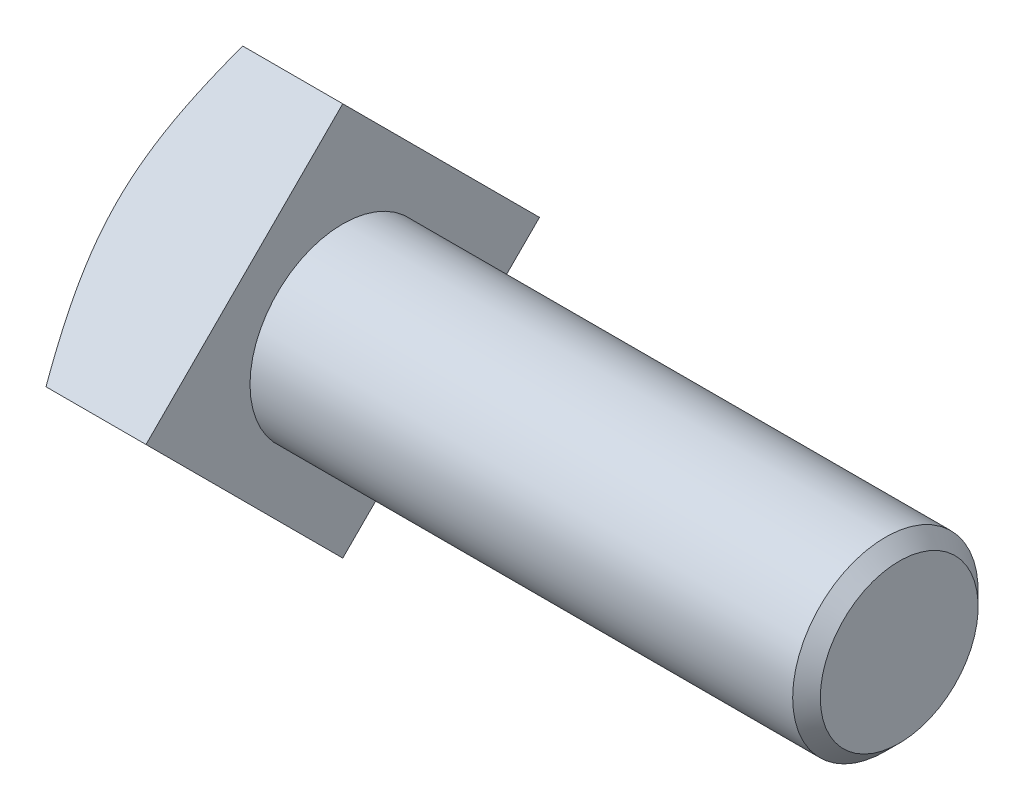
ISO-10303-21;
HEADER;
FILE_DESCRIPTION(('STEP AP214'),'2;1');
FILE_NAME('part.step','',(''),(''),'','','');
FILE_SCHEMA(('AUTOMOTIVE_DESIGN { 1 0 10303 214 1 1 1 1 }'));
ENDSEC;
DATA;
#1=APPLICATION_CONTEXT('core data for automotive mechanical design processes');
#2=APPLICATION_PROTOCOL_DEFINITION('international standard','automotive_design',2000,#1);
#3=PRODUCT_CONTEXT('',#1,'mechanical');
#4=PRODUCT('Part','Part','',(#3));
#5=PRODUCT_RELATED_PRODUCT_CATEGORY('part','',(#4));
#6=PRODUCT_DEFINITION_FORMATION('','',#4);
#7=PRODUCT_DEFINITION_CONTEXT('part definition',#1,'design');
#8=PRODUCT_DEFINITION('design','',#6,#7);
#9=PRODUCT_DEFINITION_SHAPE('','',#8);
#10=(LENGTH_UNIT() NAMED_UNIT(*) SI_UNIT(.MILLI.,.METRE.));
#11=(NAMED_UNIT(*) PLANE_ANGLE_UNIT() SI_UNIT($,.RADIAN.));
#12=(NAMED_UNIT(*) SI_UNIT($,.STERADIAN.) SOLID_ANGLE_UNIT());
#13=UNCERTAINTY_MEASURE_WITH_UNIT(LENGTH_MEASURE(1.E-05),#10,'distance_accuracy_value','');
#14=(GEOMETRIC_REPRESENTATION_CONTEXT(3) GLOBAL_UNCERTAINTY_ASSIGNED_CONTEXT((#13)) GLOBAL_UNIT_ASSIGNED_CONTEXT((#10,
#11,#12)) REPRESENTATION_CONTEXT('',''));
#15=CARTESIAN_POINT('',(0.,0.,0.));
#16=DIRECTION('',(0.,0.,1.));
#17=DIRECTION('',(1.,0.,0.));
#18=AXIS2_PLACEMENT_3D('',#15,#16,#17);
#19=CARTESIAN_POINT('',(17.3736,0.,-26.9407683632075));
#20=DIRECTION('',(0.,-0.707106781186549,0.707106781186546));
#21=DIRECTION('',(0.,-0.707106781186546,-0.707106781186549));
#22=AXIS2_PLACEMENT_3D('',#19,#20,#21);
#23=PLANE('',#22);
#24=CARTESIAN_POINT('',(3.67961897836863,26.9409683632075,0.000200000000045216));
#25=CARTESIAN_POINT('',(3.5548106744779,26.6733023350022,-0.267466028205203));
#26=CARTESIAN_POINT('',(3.43166591489863,26.4052457385589,-0.535522624648477));
#27=CARTESIAN_POINT('',(3.1890899267751,25.8682845755296,-1.0724837876778));
#28=CARTESIAN_POINT('',(3.06965881940346,25.5993799815889,-1.34138838161848));
#29=CARTESIAN_POINT('',(2.83485734138483,25.0605646045843,-1.88020375862312));
#30=CARTESIAN_POINT('',(2.71948863089288,24.7906534588859,-2.15011490432156));
#31=CARTESIAN_POINT('',(2.49331484279292,24.2498808259797,-2.69088753722775));
#32=CARTESIAN_POINT('',(2.38250972891658,23.9790193463431,-2.96174901686432));
#33=CARTESIAN_POINT('',(2.05612530796253,23.1610744333138,-3.77969392989365));
#34=CARTESIAN_POINT('',(1.84824930439006,22.6124346923039,-4.32833367090352));
#35=CARTESIAN_POINT('',(1.45758123264963,21.5107337556084,-5.430034607599));
#36=CARTESIAN_POINT('',(1.27478662714833,20.9576730131681,-5.9830953500393));
#37=CARTESIAN_POINT('',(0.945511734071481,19.8664326312515,-7.07433573195595));
#38=CARTESIAN_POINT('',(0.79798088957727,19.3284131944761,-7.61235516873135));
#39=CARTESIAN_POINT('',(0.536422228800219,18.2482773891681,-8.69249097403933));
#40=CARTESIAN_POINT('',(0.422394171895823,17.7061610500887,-9.23460731311871));
#41=CARTESIAN_POINT('',(0.233146716482555,16.6203771657464,-10.3203911974611));
#42=CARTESIAN_POINT('',(0.157794101744971,16.0767215200036,-10.8640468432038));
#43=CARTESIAN_POINT('',(0.0762638360765365,15.2597076194693,-11.6810607437382));
#44=CARTESIAN_POINT('',(0.0543365936512322,14.9871029257431,-11.9536654374643));
#45=CARTESIAN_POINT('',(0.0212582185382671,14.4415698757762,-12.4991984874312));
#46=CARTESIAN_POINT('',(0.0101066830280692,14.1686415320162,-12.7721268311912));
#47=CARTESIAN_POINT('',(-0.00161011344190508,13.605599139522,-13.3351692236855));
#48=CARTESIAN_POINT('',(-0.00146976557287539,13.3154776845977,-13.6252906786097));
#49=CARTESIAN_POINT('',(0.011159967421425,12.7353688974673,-14.2053994657402));
#50=CARTESIAN_POINT('',(0.0236494175099609,12.4453815659747,-14.4953867972328));
#51=CARTESIAN_POINT('',(0.0607802459783497,11.8657903885889,-15.0749779746185));
#52=CARTESIAN_POINT('',(0.0854218766143621,11.5761865507815,-15.364581812426));
#53=CARTESIAN_POINT('',(0.146470352139668,10.9975953278747,-15.9431730353328));
#54=CARTESIAN_POINT('',(0.182877743644435,10.7086079720439,-16.2321603911635));
#55=CARTESIAN_POINT('',(0.309293308607137,9.84074831588848,-17.100020047319));
#56=CARTESIAN_POINT('',(0.416353313854458,9.26308735289191,-17.6776810103156));
#57=CARTESIAN_POINT('',(0.670258795524519,8.11225138699092,-18.8285169762166));
#58=CARTESIAN_POINT('',(0.81710493512163,7.53907645902574,-19.4016919041817));
#59=CARTESIAN_POINT('',(1.15063001194142,6.37560138249195,-20.5651669807155));
#60=CARTESIAN_POINT('',(1.33862518399708,5.78549181858159,-21.1552765446259));
#61=CARTESIAN_POINT('',(1.74416737172929,4.61034109547358,-22.3304272677339));
#62=CARTESIAN_POINT('',(1.96171822054831,4.0253006041821,-22.9154677590254));
#63=CARTESIAN_POINT('',(2.30502412485186,3.15351567590044,-23.7872526873071));
#64=CARTESIAN_POINT('',(2.42180887555157,2.86498021977967,-24.0757881434278));
#65=CARTESIAN_POINT('',(2.66065189048929,2.28899759935433,-24.6517707638532));
#66=CARTESIAN_POINT('',(2.78271020630349,2.00155044572342,-24.9392179174841));
#67=CARTESIAN_POINT('',(3.03148171467405,1.42782962681058,-25.5129387363969));
#68=CARTESIAN_POINT('',(3.15819248210805,1.14155543424872,-25.7992129289588));
#69=CARTESIAN_POINT('',(3.41584794221307,0.569973412950501,-26.370794950257));
#70=CARTESIAN_POINT('',(3.54679246370201,0.284665545657028,-26.6561028175505));
#71=CARTESIAN_POINT('',(3.67961897836863,-0.000199999999958303,-26.9409683632075));
#72=B_SPLINE_CURVE_WITH_KNOTS('',3,(#24,#25,#26,#27,#28,#29,#30,#31,#32,#33,#34,#35,#36,#37,#38,
#39,#40,#41,#42,#43,#44,#45,#46,#47,#48,#49,#50,#51,#52,#53,#54,#55,#56,#57,#58,#59,#60,#61,#62,
#63,#64,#65,#66,#67,#68,#69,#70,#71),.UNSPECIFIED.,.F.,.F.,(4,2,2,2,2,2,2,2,2,2,2,2,2,2,2,2,2,2,
2,2,2,2,2,4),(0.,1.19574621782804,2.39153141076051,3.5877997366759,4.78405855363789,
7.1934730092088,9.60264353889679,11.9271362943406,14.2516123545547,16.5680271795087,
17.726333362957,18.8845962443842,20.1152898057051,21.3459898412049,22.5767154247725,
23.8074981937946,26.2780083205153,28.7485596294176,31.3142561631337,33.8802857660488,
35.1535601561366,36.4268470018451,37.6994793066262,38.9720602196475),.UNSPECIFIED.);
#73=CARTESIAN_POINT('',(3.67952571649083,26.9407683632075,0.));
#74=VERTEX_POINT('',#73);
#75=CARTESIAN_POINT('',(0.,13.4703841816038,-13.4703841816037));
#76=VERTEX_POINT('',#75);
#77=EDGE_CURVE('E101',#74,#76,#72,.T.);
#78=ORIENTED_EDGE('',*,*,#77,.F.);
#79=DIRECTION('',(-1.,0.,0.));
#80=VECTOR('',#79,1.);
#81=CARTESIAN_POINT('',(17.3736,26.9407683632075,0.));
#82=LINE('',#81,#80);
#83=CARTESIAN_POINT('',(17.3736,26.9407683632075,0.));
#84=VERTEX_POINT('',#83);
#85=EDGE_CURVE('E111',#84,#74,#82,.T.);
#86=ORIENTED_EDGE('',*,*,#85,.F.);
#87=DIRECTION('',(0.,0.707106781186546,0.707106781186549));
#88=VECTOR('',#87,1.);
#89=CARTESIAN_POINT('',(17.3736,0.,-26.9407683632075));
#90=LINE('',#89,#88);
#91=CARTESIAN_POINT('',(17.3736,0.,-26.9407683632075));
#92=VERTEX_POINT('',#91);
#93=EDGE_CURVE('E182',#92,#84,#90,.T.);
#94=ORIENTED_EDGE('',*,*,#93,.F.);
#95=DIRECTION('',(-1.,0.,0.));
#96=VECTOR('',#95,1.);
#97=CARTESIAN_POINT('',(17.3736,0.,-26.9407683632075));
#98=LINE('',#97,#96);
#99=CARTESIAN_POINT('',(3.67952571649083,0.,-26.9407683632075));
#100=VERTEX_POINT('',#99);
#101=EDGE_CURVE('E181',#92,#100,#98,.T.);
#102=ORIENTED_EDGE('',*,*,#101,.T.);
#103=EDGE_CURVE('E53',#76,#100,#72,.T.);
#104=ORIENTED_EDGE('',*,*,#103,.F.);
#105=EDGE_LOOP('',(#78,#86,#94,#102,#104));
#106=FACE_BOUND('',#105,.T.);
#107=ADVANCED_FACE('F32',(#106),#23,.F.);
#108=CARTESIAN_POINT('',(17.3736,0.,26.9407683632075));
#109=DIRECTION('',(0.,0.707106781186546,0.707106781186549));
#110=DIRECTION('',(0.,-0.707106781186549,0.707106781186546));
#111=AXIS2_PLACEMENT_3D('',#108,#109,#110);
#112=PLANE('',#111);
#113=ORIENTED_EDGE('',*,*,#85,.T.);
#114=CARTESIAN_POINT('',(3.67961897836863,26.9409683632075,-0.000199999999958046));
#115=CARTESIAN_POINT('',(3.5548106744779,26.6733023350022,0.267466028205296));
#116=CARTESIAN_POINT('',(3.43166591489863,26.4052457385589,0.535522624648567));
#117=CARTESIAN_POINT('',(3.1890899267751,25.8682845755296,1.07248378767788));
#118=CARTESIAN_POINT('',(3.06965881940345,25.5993799815889,1.34138838161855));
#119=CARTESIAN_POINT('',(2.83485734138483,25.0605646045843,1.8802037586232));
#120=CARTESIAN_POINT('',(2.71948863089288,24.7906534588859,2.15011490432164));
#121=CARTESIAN_POINT('',(2.49331484279293,24.2498808259797,2.69088753722783));
#122=CARTESIAN_POINT('',(2.38250972891658,23.9790193463431,2.9617490168644));
#123=CARTESIAN_POINT('',(2.05612530796252,23.1610744333138,3.77969392989372));
#124=CARTESIAN_POINT('',(1.84824930439005,22.6124346923039,4.3283336709036));
#125=CARTESIAN_POINT('',(1.45758123264963,21.5107337556084,5.43003460759907));
#126=CARTESIAN_POINT('',(1.27478662714833,20.9576730131681,5.98309535003937));
#127=CARTESIAN_POINT('',(0.945511734071483,19.8664326312515,7.07433573195601));
#128=CARTESIAN_POINT('',(0.797980889577271,19.3284131944761,7.61235516873141));
#129=CARTESIAN_POINT('',(0.536422228800219,18.2482773891681,8.69249097403939));
#130=CARTESIAN_POINT('',(0.422394171895823,17.7061610500887,9.23460731311877));
#131=CARTESIAN_POINT('',(0.233146716482557,16.6203771657463,10.3203911974611));
#132=CARTESIAN_POINT('',(0.157794101744973,16.0767215200036,10.8640468432039));
#133=CARTESIAN_POINT('',(0.0762638360765367,15.2597076194692,11.6810607437382));
#134=CARTESIAN_POINT('',(0.0543365936512313,14.9871029257431,11.9536654374644));
#135=CARTESIAN_POINT('',(0.0212582185382664,14.4415698757762,12.4991984874313));
#136=CARTESIAN_POINT('',(0.0101066830280697,14.1686415320162,12.7721268311913));
#137=CARTESIAN_POINT('',(-0.00161011344190393,13.6055991395219,13.3351692236856));
#138=CARTESIAN_POINT('',(-0.00146976557287488,13.3154776845977,13.6252906786098));
#139=CARTESIAN_POINT('',(0.0111599674214245,12.7353688974672,14.2053994657402));
#140=CARTESIAN_POINT('',(0.02364941750996,12.4453815659746,14.4953867972328));
#141=CARTESIAN_POINT('',(0.0607802459783491,11.8657903885889,15.0749779746186));
#142=CARTESIAN_POINT('',(0.0854218766143621,11.5761865507815,15.364581812426));
#143=CARTESIAN_POINT('',(0.146470352139668,10.9975953278746,15.9431730353328));
#144=CARTESIAN_POINT('',(0.182877743644435,10.7086079720439,16.2321603911636));
#145=CARTESIAN_POINT('',(0.309293308607135,9.84074831588842,17.100020047319));
#146=CARTESIAN_POINT('',(0.416353313854456,9.26308735289185,17.6776810103156));
#147=CARTESIAN_POINT('',(0.670258795524518,8.11225138699086,18.8285169762166));
#148=CARTESIAN_POINT('',(0.81710493512163,7.53907645902568,19.4016919041818));
#149=CARTESIAN_POINT('',(1.15063001194141,6.37560138249188,20.5651669807155));
#150=CARTESIAN_POINT('',(1.33862518399708,5.78549181858152,21.1552765446259));
#151=CARTESIAN_POINT('',(1.74416737172928,4.61034109547351,22.3304272677339));
#152=CARTESIAN_POINT('',(1.96171822054831,4.02530060418203,22.9154677590254));
#153=CARTESIAN_POINT('',(2.30502412485186,3.15351567590037,23.7872526873071));
#154=CARTESIAN_POINT('',(2.42180887555157,2.86498021977959,24.0757881434278));
#155=CARTESIAN_POINT('',(2.66065189048929,2.28899759935425,24.6517707638532));
#156=CARTESIAN_POINT('',(2.78271020630349,2.00155044572334,24.9392179174841));
#157=CARTESIAN_POINT('',(3.03148171467405,1.42782962681049,25.5129387363969));
#158=CARTESIAN_POINT('',(3.15819248210805,1.14155543424863,25.7992129289588));
#159=CARTESIAN_POINT('',(3.41584794221307,0.569973412950413,26.370794950257));
#160=CARTESIAN_POINT('',(3.54679246370201,0.284665545656939,26.6561028175505));
#161=CARTESIAN_POINT('',(3.67961897836863,-0.0002000000000479,26.9409683632075));
#162=B_SPLINE_CURVE_WITH_KNOTS('',3,(#114,#115,#116,#117,#118,#119,#120,#121,#122,#123,#124,
#125,#126,#127,#128,#129,#130,#131,#132,#133,#134,#135,#136,#137,#138,#139,#140,#141,#142,#143,
#144,#145,#146,#147,#148,#149,#150,#151,#152,#153,#154,#155,#156,#157,#158,#159,#160,#161),
.UNSPECIFIED.,.F.,.F.,(4,2,2,2,2,2,2,2,2,2,2,2,2,2,2,2,2,2,2,2,2,2,2,4),(0.,1.19574621782803,
2.39153141076051,3.5877997366759,4.78405855363789,7.1934730092088,9.60264353889679,
11.9271362943406,14.2516123545547,16.5680271795087,17.726333362957,18.8845962443842,
20.1152898057051,21.3459898412049,22.5767154247725,23.8074981937946,26.2780083205153,
28.7485596294176,31.3142561631337,33.8802857660488,35.1535601561366,36.4268470018451,
37.6994793066262,38.9720602196475),.UNSPECIFIED.);
#163=CARTESIAN_POINT('',(0.,13.4703841816037,13.4703841816038));
#164=VERTEX_POINT('',#163);
#165=EDGE_CURVE('E94',#74,#164,#162,.T.);
#166=ORIENTED_EDGE('',*,*,#165,.T.);
#167=CARTESIAN_POINT('',(3.67952571649083,0.,26.9407683632075));
#168=VERTEX_POINT('',#167);
#169=EDGE_CURVE('E85',#164,#168,#162,.T.);
#170=ORIENTED_EDGE('',*,*,#169,.T.);
#171=DIRECTION('',(-1.,0.,0.));
#172=VECTOR('',#171,1.);
#173=CARTESIAN_POINT('',(17.3736,0.,26.9407683632075));
#174=LINE('',#173,#172);
#175=CARTESIAN_POINT('',(17.3736,0.,26.9407683632075));
#176=VERTEX_POINT('',#175);
#177=EDGE_CURVE('E189',#176,#168,#174,.T.);
#178=ORIENTED_EDGE('',*,*,#177,.F.);
#179=DIRECTION('',(0.,0.707106781186549,-0.707106781186546));
#180=VECTOR('',#179,1.);
#181=CARTESIAN_POINT('',(17.3736,0.,26.9407683632075));
#182=LINE('',#181,#180);
#183=EDGE_CURVE('E205',#176,#84,#182,.T.);
#184=ORIENTED_EDGE('',*,*,#183,.T.);
#185=EDGE_LOOP('',(#113,#166,#170,#178,#184));
#186=FACE_BOUND('',#185,.T.);
#187=ADVANCED_FACE('F108',(#186),#112,.T.);
#188=CARTESIAN_POINT('',(17.3736,0.,26.9407683632075));
#189=DIRECTION('',(0.,0.707106781186549,-0.707106781186546));
#190=DIRECTION('',(0.,0.707106781186546,0.707106781186549));
#191=AXIS2_PLACEMENT_3D('',#188,#189,#190);
#192=PLANE('',#191);
#193=CARTESIAN_POINT('',(3.67961897836863,-26.9409683632075,-0.000200000000037707));
#194=CARTESIAN_POINT('',(3.5548106744779,-26.6733023350022,0.267466028205212));
#195=CARTESIAN_POINT('',(3.43166591489863,-26.4052457385589,0.535522624648485));
#196=CARTESIAN_POINT('',(3.1890899267751,-25.8682845755296,1.07248378767781));
#197=CARTESIAN_POINT('',(3.06965881940346,-25.5993799815889,1.34138838161848));
#198=CARTESIAN_POINT('',(2.83485734138483,-25.0605646045843,1.88020375862312));
#199=CARTESIAN_POINT('',(2.71948863089288,-24.7906534588859,2.15011490432156));
#200=CARTESIAN_POINT('',(2.49331484279292,-24.2498808259797,2.69088753722775));
#201=CARTESIAN_POINT('',(2.38250972891658,-23.9790193463431,2.96174901686433));
#202=CARTESIAN_POINT('',(2.05612530796253,-23.1610744333138,3.77969392989365));
#203=CARTESIAN_POINT('',(1.84824930439006,-22.6124346923039,4.32833367090353));
#204=CARTESIAN_POINT('',(1.45758123264964,-21.5107337556084,5.430034607599));
#205=CARTESIAN_POINT('',(1.27478662714834,-20.9576730131681,5.98309535003931));
#206=CARTESIAN_POINT('',(0.945511734071484,-19.8664326312515,7.07433573195595));
#207=CARTESIAN_POINT('',(0.797980889577274,-19.3284131944761,7.61235516873135));
#208=CARTESIAN_POINT('',(0.536422228800222,-18.2482773891681,8.69249097403933));
#209=CARTESIAN_POINT('',(0.422394171895826,-17.7061610500887,9.23460731311871));
#210=CARTESIAN_POINT('',(0.233146716482558,-16.6203771657464,10.3203911974611));
#211=CARTESIAN_POINT('',(0.157794101744974,-16.0767215200036,10.8640468432038));
#212=CARTESIAN_POINT('',(0.0762638360765389,-15.2597076194693,11.6810607437382));
#213=CARTESIAN_POINT('',(0.0543365936512346,-14.9871029257431,11.9536654374643));
#214=CARTESIAN_POINT('',(0.0212582185382695,-14.4415698757762,12.4991984874312));
#215=CARTESIAN_POINT('',(0.0101066830280716,-14.1686415320162,12.7721268311912));
#216=CARTESIAN_POINT('',(-0.0016101134419026,-13.605599139522,13.3351692236855));
#217=CARTESIAN_POINT('',(-0.00146976557287277,-13.3154776845977,13.6252906786097));
#218=CARTESIAN_POINT('',(0.0111599674214272,-12.7353688974673,14.2053994657402));
#219=CARTESIAN_POINT('',(0.0236494175099626,-12.4453815659747,14.4953867972328));
#220=CARTESIAN_POINT('',(0.0607802459783512,-11.8657903885889,15.0749779746185));
#221=CARTESIAN_POINT('',(0.0854218766143637,-11.5761865507815,15.364581812426));
#222=CARTESIAN_POINT('',(0.146470352139669,-10.9975953278747,15.9431730353328));
#223=CARTESIAN_POINT('',(0.182877743644437,-10.7086079720439,16.2321603911635));
#224=CARTESIAN_POINT('',(0.309293308607138,-9.84074831588848,17.100020047319));
#225=CARTESIAN_POINT('',(0.416353313854458,-9.26308735289192,17.6776810103156));
#226=CARTESIAN_POINT('',(0.670258795524519,-8.11225138699093,18.8285169762166));
#227=CARTESIAN_POINT('',(0.817104935121631,-7.53907645902575,19.4016919041817));
#228=CARTESIAN_POINT('',(1.15063001194142,-6.37560138249196,20.5651669807155));
#229=CARTESIAN_POINT('',(1.33862518399708,-5.7854918185816,21.1552765446259));
#230=CARTESIAN_POINT('',(1.74416737172929,-4.61034109547359,22.3304272677339));
#231=CARTESIAN_POINT('',(1.96171822054831,-4.02530060418211,22.9154677590254));
#232=CARTESIAN_POINT('',(2.30502412485186,-3.15351567590045,23.787252687307));
#233=CARTESIAN_POINT('',(2.42180887555157,-2.86498021977968,24.0757881434278));
#234=CARTESIAN_POINT('',(2.66065189048929,-2.28899759935433,24.6517707638532));
#235=CARTESIAN_POINT('',(2.78271020630349,-2.00155044572343,24.9392179174841));
#236=CARTESIAN_POINT('',(3.03148171467405,-1.42782962681058,25.5129387363969));
#237=CARTESIAN_POINT('',(3.15819248210805,-1.14155543424872,25.7992129289588));
#238=CARTESIAN_POINT('',(3.41584794221307,-0.569973412950508,26.370794950257));
#239=CARTESIAN_POINT('',(3.54679246370201,-0.284665545657037,26.6561028175505));
#240=CARTESIAN_POINT('',(3.67961897836863,0.000199999999947534,26.9409683632075));
#241=B_SPLINE_CURVE_WITH_KNOTS('',3,(#193,#194,#195,#196,#197,#198,#199,#200,#201,#202,#203,
#204,#205,#206,#207,#208,#209,#210,#211,#212,#213,#214,#215,#216,#217,#218,#219,#220,#221,#222,
#223,#224,#225,#226,#227,#228,#229,#230,#231,#232,#233,#234,#235,#236,#237,#238,#239,#240),
.UNSPECIFIED.,.F.,.F.,(4,2,2,2,2,2,2,2,2,2,2,2,2,2,2,2,2,2,2,2,2,2,2,4),(0.,1.19574621782803,
2.39153141076051,3.5877997366759,4.78405855363788,7.1934730092088,9.60264353889679,
11.9271362943406,14.2516123545547,16.5680271795087,17.726333362957,18.8845962443842,
20.1152898057051,21.3459898412049,22.5767154247725,23.8074981937946,26.2780083205153,
28.7485596294175,31.3142561631337,33.8802857660488,35.1535601561366,36.4268470018451,
37.6994793066262,38.9720602196474),.UNSPECIFIED.);
#242=CARTESIAN_POINT('',(3.67952571649083,-26.9407683632075,0.));
#243=VERTEX_POINT('',#242);
#244=CARTESIAN_POINT('',(0.,-13.4703841816038,13.4703841816037));
#245=VERTEX_POINT('',#244);
#246=EDGE_CURVE('E142',#243,#245,#241,.T.);
#247=ORIENTED_EDGE('',*,*,#246,.F.);
#248=DIRECTION('',(-1.,0.,0.));
#249=VECTOR('',#248,1.);
#250=CARTESIAN_POINT('',(17.3736,-26.9407683632075,0.));
#251=LINE('',#250,#249);
#252=CARTESIAN_POINT('',(17.3736,-26.9407683632075,0.));
#253=VERTEX_POINT('',#252);
#254=EDGE_CURVE('E185',#253,#243,#251,.T.);
#255=ORIENTED_EDGE('',*,*,#254,.F.);
#256=DIRECTION('',(0.,-0.707106781186546,-0.707106781186549));
#257=VECTOR('',#256,1.);
#258=CARTESIAN_POINT('',(17.3736,0.,26.9407683632075));
#259=LINE('',#258,#257);
#260=EDGE_CURVE('E191',#176,#253,#259,.T.);
#261=ORIENTED_EDGE('',*,*,#260,.F.);
#262=ORIENTED_EDGE('',*,*,#177,.T.);
#263=EDGE_CURVE('E90',#245,#168,#241,.T.);
#264=ORIENTED_EDGE('',*,*,#263,.F.);
#265=EDGE_LOOP('',(#247,#255,#261,#262,#264));
#266=FACE_BOUND('',#265,.T.);
#267=ADVANCED_FACE('F147',(#266),#192,.F.);
#268=CARTESIAN_POINT('',(17.3736,0.,-26.9407683632075));
#269=DIRECTION('',(0.,-0.707106781186546,-0.707106781186549));
#270=DIRECTION('',(0.,0.707106781186549,-0.707106781186546));
#271=AXIS2_PLACEMENT_3D('',#268,#269,#270);
#272=PLANE('',#271);
#273=ORIENTED_EDGE('',*,*,#254,.T.);
#274=CARTESIAN_POINT('',(3.67961897836863,-26.9409683632075,0.000199999999957179));
#275=CARTESIAN_POINT('',(3.5548106744779,-26.6733023350022,-0.267466028205298));
#276=CARTESIAN_POINT('',(3.43166591489863,-26.4052457385589,-0.535522624648569));
#277=CARTESIAN_POINT('',(3.1890899267751,-25.8682845755296,-1.07248378767788));
#278=CARTESIAN_POINT('',(3.06965881940346,-25.5993799815889,-1.34138838161855));
#279=CARTESIAN_POINT('',(2.83485734138483,-25.0605646045843,-1.8802037586232));
#280=CARTESIAN_POINT('',(2.71948863089288,-24.7906534588859,-2.15011490432164));
#281=CARTESIAN_POINT('',(2.49331484279293,-24.2498808259797,-2.69088753722783));
#282=CARTESIAN_POINT('',(2.38250972891658,-23.9790193463431,-2.9617490168644));
#283=CARTESIAN_POINT('',(2.05612530796253,-23.1610744333138,-3.77969392989372));
#284=CARTESIAN_POINT('',(1.84824930439006,-22.6124346923039,-4.32833367090359));
#285=CARTESIAN_POINT('',(1.45758123264964,-21.5107337556084,-5.43003460759906));
#286=CARTESIAN_POINT('',(1.27478662714834,-20.9576730131681,-5.98309535003937));
#287=CARTESIAN_POINT('',(0.945511734071483,-19.8664326312515,-7.07433573195601));
#288=CARTESIAN_POINT('',(0.797980889577275,-19.3284131944761,-7.61235516873141));
#289=CARTESIAN_POINT('',(0.536422228800223,-18.2482773891681,-8.69249097403939));
#290=CARTESIAN_POINT('',(0.422394171895824,-17.7061610500887,-9.23460731311877));
#291=CARTESIAN_POINT('',(0.233146716482556,-16.6203771657463,-10.3203911974611));
#292=CARTESIAN_POINT('',(0.157794101744973,-16.0767215200036,-10.8640468432039));
#293=CARTESIAN_POINT('',(0.076263836076538,-15.2597076194692,-11.6810607437382));
#294=CARTESIAN_POINT('',(0.054336593651233,-14.9871029257431,-11.9536654374644));
#295=CARTESIAN_POINT('',(0.0212582185382679,-14.4415698757762,-12.4991984874313));
#296=CARTESIAN_POINT('',(0.0101066830280708,-14.1686415320162,-12.7721268311913));
#297=CARTESIAN_POINT('',(-0.00161011344190344,-13.6055991395219,-13.3351692236855));
#298=CARTESIAN_POINT('',(-0.00146976557287458,-13.3154776845977,-13.6252906786098));
#299=CARTESIAN_POINT('',(0.0111599674214242,-12.7353688974672,-14.2053994657402));
#300=CARTESIAN_POINT('',(0.0236494175099593,-12.4453815659746,-14.4953867972328));
#301=CARTESIAN_POINT('',(0.0607802459783481,-11.8657903885889,-15.0749779746186));
#302=CARTESIAN_POINT('',(0.0854218766143613,-11.5761865507815,-15.364581812426));
#303=CARTESIAN_POINT('',(0.146470352139667,-10.9975953278747,-15.9431730353328));
#304=CARTESIAN_POINT('',(0.182877743644434,-10.7086079720439,-16.2321603911636));
#305=CARTESIAN_POINT('',(0.309293308607134,-9.84074831588843,-17.100020047319));
#306=CARTESIAN_POINT('',(0.416353313854455,-9.26308735289186,-17.6776810103156));
#307=CARTESIAN_POINT('',(0.670258795524518,-8.11225138699086,-18.8285169762166));
#308=CARTESIAN_POINT('',(0.81710493512163,-7.53907645902569,-19.4016919041818));
#309=CARTESIAN_POINT('',(1.15063001194142,-6.37560138249189,-20.5651669807155));
#310=CARTESIAN_POINT('',(1.33862518399708,-5.78549181858152,-21.1552765446259));
#311=CARTESIAN_POINT('',(1.74416737172929,-4.61034109547351,-22.3304272677339));
#312=CARTESIAN_POINT('',(1.96171822054831,-4.02530060418203,-22.9154677590254));
#313=CARTESIAN_POINT('',(2.30502412485186,-3.15351567590037,-23.7872526873071));
#314=CARTESIAN_POINT('',(2.42180887555157,-2.86498021977959,-24.0757881434278));
#315=CARTESIAN_POINT('',(2.66065189048929,-2.28899759935425,-24.6517707638532));
#316=CARTESIAN_POINT('',(2.78271020630349,-2.00155044572334,-24.9392179174841));
#317=CARTESIAN_POINT('',(3.03148171467406,-1.42782962681049,-25.5129387363969));
#318=CARTESIAN_POINT('',(3.15819248210805,-1.14155543424863,-25.7992129289588));
#319=CARTESIAN_POINT('',(3.41584794221307,-0.569973412950415,-26.370794950257));
#320=CARTESIAN_POINT('',(3.54679246370201,-0.284665545656943,-26.6561028175505));
#321=CARTESIAN_POINT('',(3.67961897836863,0.00020000000004155,-26.9409683632075));
#322=B_SPLINE_CURVE_WITH_KNOTS('',3,(#274,#275,#276,#277,#278,#279,#280,#281,#282,#283,#284,
#285,#286,#287,#288,#289,#290,#291,#292,#293,#294,#295,#296,#297,#298,#299,#300,#301,#302,#303,
#304,#305,#306,#307,#308,#309,#310,#311,#312,#313,#314,#315,#316,#317,#318,#319,#320,#321),
.UNSPECIFIED.,.F.,.F.,(4,2,2,2,2,2,2,2,2,2,2,2,2,2,2,2,2,2,2,2,2,2,2,4),(0.,1.19574621782803,
2.39153141076051,3.58779973667589,4.78405855363788,7.19347300920879,9.60264353889679,
11.9271362943406,14.2516123545547,16.5680271795087,17.726333362957,18.8845962443842,
20.1152898057051,21.3459898412049,22.5767154247725,23.8074981937946,26.2780083205153,
28.7485596294176,31.3142561631337,33.8802857660488,35.1535601561366,36.4268470018451,
37.6994793066262,38.9720602196475),.UNSPECIFIED.);
#323=CARTESIAN_POINT('',(0.,-13.4703841816037,-13.4703841816038));
#324=VERTEX_POINT('',#323);
#325=EDGE_CURVE('E146',#243,#324,#322,.T.);
#326=ORIENTED_EDGE('',*,*,#325,.T.);
#327=EDGE_CURVE('E104',#324,#100,#322,.T.);
#328=ORIENTED_EDGE('',*,*,#327,.T.);
#329=ORIENTED_EDGE('',*,*,#101,.F.);
#330=DIRECTION('',(0.,-0.707106781186549,0.707106781186547));
#331=VECTOR('',#330,1.);
#332=CARTESIAN_POINT('',(17.3736,0.,-26.9407683632075));
#333=LINE('',#332,#331);
#334=EDGE_CURVE('E186',#92,#253,#333,.T.);
#335=ORIENTED_EDGE('',*,*,#334,.T.);
#336=EDGE_LOOP('',(#273,#326,#328,#329,#335));
#337=FACE_BOUND('',#336,.T.);
#338=ADVANCED_FACE('F150',(#337),#272,.T.);
#339=CARTESIAN_POINT('',(17.3736,0.,-26.9407683632075));
#340=DIRECTION('',(1.,0.,0.));
#341=DIRECTION('',(0.,0.,-1.));
#342=AXIS2_PLACEMENT_3D('',#339,#340,#341);
#343=PLANE('',#342);
#344=CARTESIAN_POINT('',(17.3736,0.,0.));
#345=DIRECTION('',(1.,0.,0.));
#346=DIRECTION('',(0.,0.,-1.));
#347=AXIS2_PLACEMENT_3D('',#344,#345,#346);
#348=CIRCLE('',#347,12.7);
#349=CARTESIAN_POINT('',(17.3736,0.,-12.7));
#350=VERTEX_POINT('',#349);
#351=EDGE_CURVE('E196',#350,#350,#348,.T.);
#352=ORIENTED_EDGE('',*,*,#351,.F.);
#353=EDGE_LOOP('',(#352));
#354=FACE_BOUND('',#353,.T.);
#355=ORIENTED_EDGE('',*,*,#93,.T.);
#356=ORIENTED_EDGE('',*,*,#183,.F.);
#357=ORIENTED_EDGE('',*,*,#260,.T.);
#358=ORIENTED_EDGE('',*,*,#334,.F.);
#359=EDGE_LOOP('',(#355,#356,#357,#358));
#360=FACE_BOUND('',#359,.T.);
#361=ADVANCED_FACE('F155',(#354,#360),#343,.T.);
#362=CARTESIAN_POINT('',(0.,0.,0.));
#363=DIRECTION('',(-1.,0.,0.));
#364=DIRECTION('',(0.,0.,1.));
#365=AXIS2_PLACEMENT_3D('',#362,#363,#364);
#366=CYLINDRICAL_SURFACE('',#365,12.7);
#367=CARTESIAN_POINT('',(91.6813,0.,0.));
#368=DIRECTION('',(-1.,0.,0.));
#369=DIRECTION('',(0.,0.,1.));
#370=AXIS2_PLACEMENT_3D('',#367,#368,#369);
#371=CIRCLE('',#370,12.7);
#372=CARTESIAN_POINT('',(91.6813,0.,12.7));
#373=VERTEX_POINT('',#372);
#374=EDGE_CURVE('E114',#373,#373,#371,.T.);
#375=ORIENTED_EDGE('',*,*,#374,.T.);
#376=EDGE_LOOP('',(#375));
#377=FACE_BOUND('',#376,.T.);
#378=ORIENTED_EDGE('',*,*,#351,.T.);
#379=EDGE_LOOP('',(#378));
#380=FACE_BOUND('',#379,.T.);
#381=ADVANCED_FACE('F161',(#377,#380),#366,.T.);
#382=CARTESIAN_POINT('',(91.6813,0.,0.));
#383=DIRECTION('',(-1.,0.,0.));
#384=DIRECTION('',(0.,0.,1.));
#385=AXIS2_PLACEMENT_3D('',#382,#383,#384);
#386=CONICAL_SURFACE('',#385,12.7,0.785398163397445);
#387=CARTESIAN_POINT('',(93.5736,0.,0.));
#388=DIRECTION('',(-1.,0.,0.));
#389=DIRECTION('',(0.,0.,1.));
#390=AXIS2_PLACEMENT_3D('',#387,#388,#389);
#391=CIRCLE('',#390,10.8077);
#392=CARTESIAN_POINT('',(93.5736,0.,10.8077));
#393=VERTEX_POINT('',#392);
#394=EDGE_CURVE('E112',#393,#393,#391,.T.);
#395=ORIENTED_EDGE('',*,*,#394,.T.);
#396=EDGE_LOOP('',(#395));
#397=FACE_BOUND('',#396,.T.);
#398=ORIENTED_EDGE('',*,*,#374,.F.);
#399=EDGE_LOOP('',(#398));
#400=FACE_BOUND('',#399,.T.);
#401=ADVANCED_FACE('F164',(#397,#400),#386,.T.);
#402=CARTESIAN_POINT('',(93.5736,10.8077,0.));
#403=DIRECTION('',(1.,0.,0.));
#404=DIRECTION('',(0.,0.,-1.));
#405=AXIS2_PLACEMENT_3D('',#402,#403,#404);
#406=PLANE('',#405);
#407=ORIENTED_EDGE('',*,*,#394,.F.);
#408=EDGE_LOOP('',(#407));
#409=FACE_BOUND('',#408,.T.);
#410=ADVANCED_FACE('F132',(#409),#406,.T.);
#411=CARTESIAN_POINT('',(0.,0.,0.));
#412=DIRECTION('',(1.,0.,0.));
#413=DIRECTION('',(0.,0.,-1.));
#414=AXIS2_PLACEMENT_3D('',#411,#412,#413);
#415=CONICAL_SURFACE('',#414,19.05,1.13446401379631);
#416=ORIENTED_EDGE('',*,*,#103,.T.);
#417=ORIENTED_EDGE('',*,*,#327,.F.);
#418=CARTESIAN_POINT('',(0.,0.,0.));
#419=DIRECTION('',(1.,0.,0.));
#420=DIRECTION('',(0.,0.,-1.));
#421=AXIS2_PLACEMENT_3D('',#418,#419,#420);
#422=CIRCLE('',#421,19.05);
#423=EDGE_CURVE('E36',#76,#324,#422,.F.);
#424=ORIENTED_EDGE('',*,*,#423,.F.);
#425=EDGE_LOOP('',(#416,#417,#424));
#426=FACE_BOUND('',#425,.T.);
#427=ADVANCED_FACE('F171',(#426),#415,.T.);
#428=ORIENTED_EDGE('',*,*,#77,.T.);
#429=CARTESIAN_POINT('',(0.,0.,0.));
#430=DIRECTION('',(-1.,0.,0.));
#431=DIRECTION('',(0.,0.,1.));
#432=AXIS2_PLACEMENT_3D('',#429,#430,#431);
#433=CIRCLE('',#432,19.05);
#434=EDGE_CURVE('E98',#164,#76,#433,.T.);
#435=ORIENTED_EDGE('',*,*,#434,.F.);
#436=ORIENTED_EDGE('',*,*,#165,.F.);
#437=EDGE_LOOP('',(#428,#435,#436));
#438=FACE_BOUND('',#437,.T.);
#439=ADVANCED_FACE('F99',(#438),#415,.T.);
#440=EDGE_CURVE('E41',#245,#164,#422,.F.);
#441=ORIENTED_EDGE('',*,*,#440,.F.);
#442=ORIENTED_EDGE('',*,*,#263,.T.);
#443=ORIENTED_EDGE('',*,*,#169,.F.);
#444=EDGE_LOOP('',(#441,#442,#443));
#445=FACE_BOUND('',#444,.T.);
#446=ADVANCED_FACE('F87',(#445),#415,.T.);
#447=ORIENTED_EDGE('',*,*,#246,.T.);
#448=EDGE_CURVE('E11',#324,#245,#422,.F.);
#449=ORIENTED_EDGE('',*,*,#448,.F.);
#450=ORIENTED_EDGE('',*,*,#325,.F.);
#451=EDGE_LOOP('',(#447,#449,#450));
#452=FACE_BOUND('',#451,.T.);
#453=ADVANCED_FACE('F131',(#452),#415,.T.);
#454=CARTESIAN_POINT('',(0.,0.,-26.9407683632075));
#455=DIRECTION('',(1.,0.,0.));
#456=DIRECTION('',(0.,0.,-1.));
#457=AXIS2_PLACEMENT_3D('',#454,#455,#456);
#458=PLANE('',#457);
#459=ORIENTED_EDGE('',*,*,#423,.T.);
#460=ORIENTED_EDGE('',*,*,#448,.T.);
#461=ORIENTED_EDGE('',*,*,#440,.T.);
#462=ORIENTED_EDGE('',*,*,#434,.T.);
#463=EDGE_LOOP('',(#459,#460,#461,#462));
#464=FACE_BOUND('',#463,.T.);
#465=ADVANCED_FACE('F106',(#464),#458,.F.);
#466=CLOSED_SHELL('',(#107,#187,#267,#338,#361,#381,#401,#410,#427,#439,#446,#453,#465));
#467=MANIFOLD_SOLID_BREP('B2',#466);
#468=ADVANCED_BREP_SHAPE_REPRESENTATION('',(#18,#467),#14);
#469=SHAPE_DEFINITION_REPRESENTATION(#9,#468);
ENDSEC;
END-ISO-10303-21;
